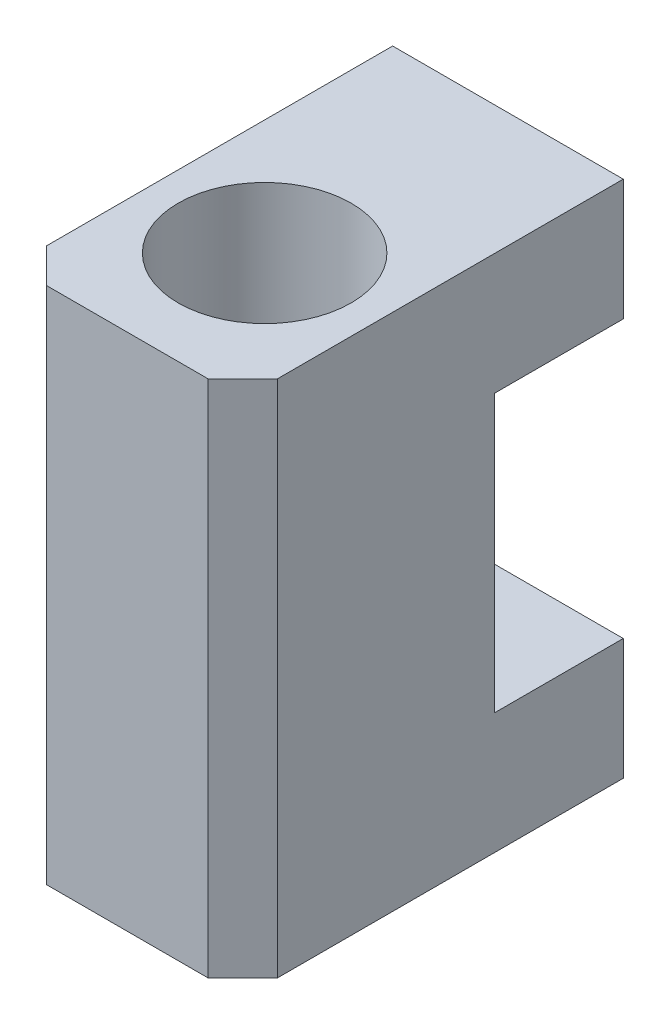
ISO-10303-21;
HEADER;
FILE_DESCRIPTION(('STEP AP214'),'2;1');
FILE_NAME('part.step','',(''),(''),'','','');
FILE_SCHEMA(('AUTOMOTIVE_DESIGN { 1 0 10303 214 1 1 1 1 }'));
ENDSEC;
DATA;
#1=APPLICATION_CONTEXT('core data for automotive mechanical design processes');
#2=APPLICATION_PROTOCOL_DEFINITION('international standard','automotive_design',2000,#1);
#3=PRODUCT_CONTEXT('',#1,'mechanical');
#4=PRODUCT('Part','Part','',(#3));
#5=PRODUCT_RELATED_PRODUCT_CATEGORY('part','',(#4));
#6=PRODUCT_DEFINITION_FORMATION('','',#4);
#7=PRODUCT_DEFINITION_CONTEXT('part definition',#1,'design');
#8=PRODUCT_DEFINITION('design','',#6,#7);
#9=PRODUCT_DEFINITION_SHAPE('','',#8);
#10=(LENGTH_UNIT() NAMED_UNIT(*) SI_UNIT(.MILLI.,.METRE.));
#11=(NAMED_UNIT(*) PLANE_ANGLE_UNIT() SI_UNIT($,.RADIAN.));
#12=(NAMED_UNIT(*) SI_UNIT($,.STERADIAN.) SOLID_ANGLE_UNIT());
#13=UNCERTAINTY_MEASURE_WITH_UNIT(LENGTH_MEASURE(1.E-05),#10,'distance_accuracy_value','');
#14=(GEOMETRIC_REPRESENTATION_CONTEXT(3) GLOBAL_UNCERTAINTY_ASSIGNED_CONTEXT((#13)) GLOBAL_UNIT_ASSIGNED_CONTEXT((#10,
#11,#12)) REPRESENTATION_CONTEXT('',''));
#15=CARTESIAN_POINT('',(0.,0.,0.));
#16=DIRECTION('',(0.,0.,1.));
#17=DIRECTION('',(1.,0.,0.));
#18=AXIS2_PLACEMENT_3D('',#15,#16,#17);
#19=CARTESIAN_POINT('',(0.,0.,-33.));
#20=DIRECTION('',(0.,0.,-1.));
#21=DIRECTION('',(-1.,0.,0.));
#22=AXIS2_PLACEMENT_3D('',#19,#20,#21);
#23=PLANE('',#22);
#24=DIRECTION('',(1.,0.,0.));
#25=VECTOR('',#24,1.);
#26=CARTESIAN_POINT('',(0.,34.5,-33.));
#27=LINE('',#26,#25);
#28=CARTESIAN_POINT('',(0.,34.5,-33.));
#29=VERTEX_POINT('',#28);
#30=CARTESIAN_POINT('',(20.,34.5,-33.));
#31=VERTEX_POINT('',#30);
#32=EDGE_CURVE('E43',#29,#31,#27,.T.);
#33=ORIENTED_EDGE('',*,*,#32,.F.);
#34=DIRECTION('',(0.,-1.,0.));
#35=VECTOR('',#34,1.);
#36=CARTESIAN_POINT('',(0.,0.,-33.));
#37=LINE('',#36,#35);
#38=CARTESIAN_POINT('',(0.,45.,-33.));
#39=VERTEX_POINT('',#38);
#40=EDGE_CURVE('E142',#39,#29,#37,.T.);
#41=ORIENTED_EDGE('',*,*,#40,.F.);
#42=DIRECTION('',(-1.,0.,0.));
#43=VECTOR('',#42,1.);
#44=CARTESIAN_POINT('',(0.,45.,-33.));
#45=LINE('',#44,#43);
#46=CARTESIAN_POINT('',(20.,45.,-33.));
#47=VERTEX_POINT('',#46);
#48=EDGE_CURVE('E157',#47,#39,#45,.T.);
#49=ORIENTED_EDGE('',*,*,#48,.F.);
#50=DIRECTION('',(0.,1.,0.));
#51=VECTOR('',#50,1.);
#52=CARTESIAN_POINT('',(20.,0.,-33.));
#53=LINE('',#52,#51);
#54=EDGE_CURVE('E154',#31,#47,#53,.T.);
#55=ORIENTED_EDGE('',*,*,#54,.F.);
#56=EDGE_LOOP('',(#33,#41,#49,#55));
#57=FACE_BOUND('',#56,.T.);
#58=CARTESIAN_POINT('',(10.,39.,-33.));
#59=DIRECTION('',(0.,0.,-1.));
#60=DIRECTION('',(-1.,0.,0.));
#61=AXIS2_PLACEMENT_3D('',#58,#59,#60);
#62=CIRCLE('',#61,2.);
#63=CARTESIAN_POINT('',(8.,39.,-33.));
#64=VERTEX_POINT('',#63);
#65=EDGE_CURVE('E233',#64,#64,#62,.T.);
#66=ORIENTED_EDGE('',*,*,#65,.F.);
#67=EDGE_LOOP('',(#66));
#68=FACE_BOUND('',#67,.T.);
#69=ADVANCED_FACE('F35',(#57,#68),#23,.T.);
#70=CARTESIAN_POINT('',(0.,0.,-33.));
#71=DIRECTION('',(-1.,0.,0.));
#72=DIRECTION('',(0.,0.,1.));
#73=AXIS2_PLACEMENT_3D('',#70,#71,#72);
#74=PLANE('',#73);
#75=DIRECTION('',(0.,0.,-1.));
#76=VECTOR('',#75,1.);
#77=CARTESIAN_POINT('',(0.,34.5,-33.));
#78=LINE('',#77,#76);
#79=CARTESIAN_POINT('',(0.,34.5,-21.8540067878814));
#80=VERTEX_POINT('',#79);
#81=EDGE_CURVE('E194',#80,#29,#78,.T.);
#82=ORIENTED_EDGE('',*,*,#81,.F.);
#83=DIRECTION('',(0.,1.,0.));
#84=VECTOR('',#83,1.);
#85=CARTESIAN_POINT('',(0.,34.5,-21.8540067878814));
#86=LINE('',#85,#84);
#87=CARTESIAN_POINT('',(0.,10.5,-21.8540067878814));
#88=VERTEX_POINT('',#87);
#89=EDGE_CURVE('E135',#88,#80,#86,.T.);
#90=ORIENTED_EDGE('',*,*,#89,.F.);
#91=DIRECTION('',(0.,0.,1.));
#92=VECTOR('',#91,1.);
#93=CARTESIAN_POINT('',(0.,10.5,-33.));
#94=LINE('',#93,#92);
#95=CARTESIAN_POINT('',(0.,10.5,-33.));
#96=VERTEX_POINT('',#95);
#97=EDGE_CURVE('E120',#96,#88,#94,.T.);
#98=ORIENTED_EDGE('',*,*,#97,.F.);
#99=CARTESIAN_POINT('',(0.,0.,-33.));
#100=VERTEX_POINT('',#99);
#101=EDGE_CURVE('E132',#96,#100,#37,.T.);
#102=ORIENTED_EDGE('',*,*,#101,.T.);
#103=DIRECTION('',(0.,0.,1.));
#104=VECTOR('',#103,1.);
#105=CARTESIAN_POINT('',(0.,0.,-33.));
#106=LINE('',#105,#104);
#107=CARTESIAN_POINT('',(0.,0.,-3.00000000000002));
#108=VERTEX_POINT('',#107);
#109=EDGE_CURVE('E160',#100,#108,#106,.T.);
#110=ORIENTED_EDGE('',*,*,#109,.T.);
#111=DIRECTION('',(0.,1.,0.));
#112=VECTOR('',#111,1.);
#113=CARTESIAN_POINT('',(0.,45.,-3.00000000000002));
#114=LINE('',#113,#112);
#115=CARTESIAN_POINT('',(0.,45.,-3.00000000000002));
#116=VERTEX_POINT('',#115);
#117=EDGE_CURVE('E183',#108,#116,#114,.T.);
#118=ORIENTED_EDGE('',*,*,#117,.T.);
#119=DIRECTION('',(0.,0.,1.));
#120=VECTOR('',#119,1.);
#121=CARTESIAN_POINT('',(0.,45.,-33.));
#122=LINE('',#121,#120);
#123=EDGE_CURVE('E164',#39,#116,#122,.T.);
#124=ORIENTED_EDGE('',*,*,#123,.F.);
#125=ORIENTED_EDGE('',*,*,#40,.T.);
#126=EDGE_LOOP('',(#82,#90,#98,#102,#110,#118,#124,#125));
#127=FACE_BOUND('',#126,.T.);
#128=ADVANCED_FACE('F130',(#127),#74,.T.);
#129=CARTESIAN_POINT('',(0.,45.,-33.));
#130=DIRECTION('',(0.,1.,0.));
#131=DIRECTION('',(0.,0.,1.));
#132=AXIS2_PLACEMENT_3D('',#129,#130,#131);
#133=PLANE('',#132);
#134=CARTESIAN_POINT('',(10.,45.,-11.9));
#135=DIRECTION('',(0.,-1.,0.));
#136=DIRECTION('',(0.,0.,-1.));
#137=AXIS2_PLACEMENT_3D('',#134,#135,#136);
#138=CIRCLE('',#137,7.49999999999999);
#139=CARTESIAN_POINT('',(10.,45.,-19.4));
#140=VERTEX_POINT('',#139);
#141=EDGE_CURVE('E162',#140,#140,#138,.T.);
#142=ORIENTED_EDGE('',*,*,#141,.T.);
#143=EDGE_LOOP('',(#142));
#144=FACE_BOUND('',#143,.T.);
#145=ORIENTED_EDGE('',*,*,#123,.T.);
#146=DIRECTION('',(0.707106781186546,0.,0.707106781186549));
#147=VECTOR('',#146,1.);
#148=CARTESIAN_POINT('',(-15.,45.,-18.0000000000001));
#149=LINE('',#148,#147);
#150=CARTESIAN_POINT('',(3.,45.,0.));
#151=VERTEX_POINT('',#150);
#152=EDGE_CURVE('E186',#116,#151,#149,.T.);
#153=ORIENTED_EDGE('',*,*,#152,.T.);
#154=DIRECTION('',(-1.,0.,0.));
#155=VECTOR('',#154,1.);
#156=CARTESIAN_POINT('',(0.,45.,0.));
#157=LINE('',#156,#155);
#158=CARTESIAN_POINT('',(17.,45.,0.));
#159=VERTEX_POINT('',#158);
#160=EDGE_CURVE('E143',#159,#151,#157,.T.);
#161=ORIENTED_EDGE('',*,*,#160,.F.);
#162=DIRECTION('',(0.707106781186546,0.,-0.707106781186549));
#163=VECTOR('',#162,1.);
#164=CARTESIAN_POINT('',(25.,45.,-8.00000000000007));
#165=LINE('',#164,#163);
#166=CARTESIAN_POINT('',(20.,45.,-3.00000000000001));
#167=VERTEX_POINT('',#166);
#168=EDGE_CURVE('E58',#159,#167,#165,.T.);
#169=ORIENTED_EDGE('',*,*,#168,.T.);
#170=DIRECTION('',(0.,0.,1.));
#171=VECTOR('',#170,1.);
#172=CARTESIAN_POINT('',(20.,45.,-33.));
#173=LINE('',#172,#171);
#174=EDGE_CURVE('E168',#47,#167,#173,.T.);
#175=ORIENTED_EDGE('',*,*,#174,.F.);
#176=ORIENTED_EDGE('',*,*,#48,.T.);
#177=EDGE_LOOP('',(#145,#153,#161,#169,#175,#176));
#178=FACE_BOUND('',#177,.T.);
#179=ADVANCED_FACE('F205',(#144,#178),#133,.T.);
#180=CARTESIAN_POINT('',(20.,0.,-33.));
#181=DIRECTION('',(1.,0.,0.));
#182=DIRECTION('',(0.,0.,-1.));
#183=AXIS2_PLACEMENT_3D('',#180,#181,#182);
#184=PLANE('',#183);
#185=DIRECTION('',(0.,0.,1.));
#186=VECTOR('',#185,1.);
#187=CARTESIAN_POINT('',(20.,34.5,-33.));
#188=LINE('',#187,#186);
#189=CARTESIAN_POINT('',(20.,34.5,-21.8540067878814));
#190=VERTEX_POINT('',#189);
#191=EDGE_CURVE('E192',#31,#190,#188,.T.);
#192=ORIENTED_EDGE('',*,*,#191,.F.);
#193=ORIENTED_EDGE('',*,*,#54,.T.);
#194=ORIENTED_EDGE('',*,*,#174,.T.);
#195=DIRECTION('',(0.,-1.,0.));
#196=VECTOR('',#195,1.);
#197=CARTESIAN_POINT('',(20.,0.,-3.00000000000001));
#198=LINE('',#197,#196);
#199=CARTESIAN_POINT('',(20.,0.,-3.00000000000001));
#200=VERTEX_POINT('',#199);
#201=EDGE_CURVE('E126',#167,#200,#198,.T.);
#202=ORIENTED_EDGE('',*,*,#201,.T.);
#203=DIRECTION('',(0.,0.,1.));
#204=VECTOR('',#203,1.);
#205=CARTESIAN_POINT('',(20.,0.,-33.));
#206=LINE('',#205,#204);
#207=CARTESIAN_POINT('',(20.,0.,-33.));
#208=VERTEX_POINT('',#207);
#209=EDGE_CURVE('E170',#208,#200,#206,.T.);
#210=ORIENTED_EDGE('',*,*,#209,.F.);
#211=CARTESIAN_POINT('',(20.,10.5,-33.));
#212=VERTEX_POINT('',#211);
#213=EDGE_CURVE('E155',#208,#212,#53,.T.);
#214=ORIENTED_EDGE('',*,*,#213,.T.);
#215=DIRECTION('',(0.,0.,-1.));
#216=VECTOR('',#215,1.);
#217=CARTESIAN_POINT('',(20.,10.5,-33.));
#218=LINE('',#217,#216);
#219=CARTESIAN_POINT('',(20.,10.5,-21.8540067878814));
#220=VERTEX_POINT('',#219);
#221=EDGE_CURVE('E50',#220,#212,#218,.T.);
#222=ORIENTED_EDGE('',*,*,#221,.F.);
#223=DIRECTION('',(0.,-1.,0.));
#224=VECTOR('',#223,1.);
#225=CARTESIAN_POINT('',(20.,0.,-21.8540067878814));
#226=LINE('',#225,#224);
#227=EDGE_CURVE('E11',#190,#220,#226,.T.);
#228=ORIENTED_EDGE('',*,*,#227,.F.);
#229=EDGE_LOOP('',(#192,#193,#194,#202,#210,#214,#222,#228));
#230=FACE_BOUND('',#229,.T.);
#231=ADVANCED_FACE('F200',(#230),#184,.T.);
#232=CARTESIAN_POINT('',(0.,0.,-33.));
#233=DIRECTION('',(0.,-1.,0.));
#234=DIRECTION('',(0.,0.,-1.));
#235=AXIS2_PLACEMENT_3D('',#232,#233,#234);
#236=PLANE('',#235);
#237=CARTESIAN_POINT('',(10.,0.,-11.9));
#238=DIRECTION('',(0.,-1.,0.));
#239=DIRECTION('',(0.,0.,-1.));
#240=AXIS2_PLACEMENT_3D('',#237,#238,#239);
#241=CIRCLE('',#240,7.49999999999999);
#242=CARTESIAN_POINT('',(10.,0.,-19.4));
#243=VERTEX_POINT('',#242);
#244=EDGE_CURVE('E151',#243,#243,#241,.T.);
#245=ORIENTED_EDGE('',*,*,#244,.F.);
#246=EDGE_LOOP('',(#245));
#247=FACE_BOUND('',#246,.T.);
#248=DIRECTION('',(1.,0.,0.));
#249=VECTOR('',#248,1.);
#250=CARTESIAN_POINT('',(0.,0.,0.));
#251=LINE('',#250,#249);
#252=CARTESIAN_POINT('',(3.,0.,0.));
#253=VERTEX_POINT('',#252);
#254=CARTESIAN_POINT('',(17.,0.,0.));
#255=VERTEX_POINT('',#254);
#256=EDGE_CURVE('E147',#253,#255,#251,.T.);
#257=ORIENTED_EDGE('',*,*,#256,.F.);
#258=DIRECTION('',(-0.707106781186546,0.,-0.707106781186549));
#259=VECTOR('',#258,1.);
#260=CARTESIAN_POINT('',(-15.,0.,-18.0000000000001));
#261=LINE('',#260,#259);
#262=EDGE_CURVE('E181',#253,#108,#261,.T.);
#263=ORIENTED_EDGE('',*,*,#262,.T.);
#264=ORIENTED_EDGE('',*,*,#109,.F.);
#265=DIRECTION('',(1.,0.,0.));
#266=VECTOR('',#265,1.);
#267=CARTESIAN_POINT('',(0.,0.,-33.));
#268=LINE('',#267,#266);
#269=EDGE_CURVE('E141',#100,#208,#268,.T.);
#270=ORIENTED_EDGE('',*,*,#269,.T.);
#271=ORIENTED_EDGE('',*,*,#209,.T.);
#272=DIRECTION('',(-0.707106781186546,0.,0.707106781186549));
#273=VECTOR('',#272,1.);
#274=CARTESIAN_POINT('',(25.,0.,-8.00000000000007));
#275=LINE('',#274,#273);
#276=EDGE_CURVE('E179',#200,#255,#275,.T.);
#277=ORIENTED_EDGE('',*,*,#276,.T.);
#278=EDGE_LOOP('',(#257,#263,#264,#270,#271,#277));
#279=FACE_BOUND('',#278,.T.);
#280=ADVANCED_FACE('F213',(#247,#279),#236,.T.);
#281=DIRECTION('',(-1.,0.,0.));
#282=VECTOR('',#281,1.);
#283=CARTESIAN_POINT('',(0.,10.5,-33.));
#284=LINE('',#283,#282);
#285=EDGE_CURVE('E117',#212,#96,#284,.T.);
#286=ORIENTED_EDGE('',*,*,#285,.F.);
#287=ORIENTED_EDGE('',*,*,#213,.F.);
#288=ORIENTED_EDGE('',*,*,#269,.F.);
#289=ORIENTED_EDGE('',*,*,#101,.F.);
#290=EDGE_LOOP('',(#286,#287,#288,#289));
#291=FACE_BOUND('',#290,.T.);
#292=CARTESIAN_POINT('',(10.,6.,-33.));
#293=DIRECTION('',(0.,0.,-1.));
#294=DIRECTION('',(-1.,0.,0.));
#295=AXIS2_PLACEMENT_3D('',#292,#293,#294);
#296=CIRCLE('',#295,2.);
#297=CARTESIAN_POINT('',(8.,6.,-33.));
#298=VERTEX_POINT('',#297);
#299=EDGE_CURVE('E201',#298,#298,#296,.T.);
#300=ORIENTED_EDGE('',*,*,#299,.F.);
#301=EDGE_LOOP('',(#300));
#302=FACE_BOUND('',#301,.T.);
#303=ADVANCED_FACE('F138',(#291,#302),#23,.T.);
#304=CARTESIAN_POINT('',(0.,0.,0.));
#305=DIRECTION('',(0.,0.,-1.));
#306=DIRECTION('',(-1.,0.,0.));
#307=AXIS2_PLACEMENT_3D('',#304,#305,#306);
#308=PLANE('',#307);
#309=ORIENTED_EDGE('',*,*,#160,.T.);
#310=DIRECTION('',(0.,-1.,0.));
#311=VECTOR('',#310,1.);
#312=CARTESIAN_POINT('',(3.,0.,0.));
#313=LINE('',#312,#311);
#314=EDGE_CURVE('E176',#151,#253,#313,.T.);
#315=ORIENTED_EDGE('',*,*,#314,.T.);
#316=ORIENTED_EDGE('',*,*,#256,.T.);
#317=DIRECTION('',(0.,1.,0.));
#318=VECTOR('',#317,1.);
#319=CARTESIAN_POINT('',(17.,45.,0.));
#320=LINE('',#319,#318);
#321=EDGE_CURVE('E167',#255,#159,#320,.T.);
#322=ORIENTED_EDGE('',*,*,#321,.T.);
#323=EDGE_LOOP('',(#309,#315,#316,#322));
#324=FACE_BOUND('',#323,.T.);
#325=ADVANCED_FACE('F215',(#324),#308,.F.);
#326=CARTESIAN_POINT('',(10.,45.,-11.9));
#327=DIRECTION('',(0.,-1.,0.));
#328=DIRECTION('',(0.,0.,-1.));
#329=AXIS2_PLACEMENT_3D('',#326,#327,#328);
#330=CYLINDRICAL_SURFACE('',#329,7.49999999999999);
#331=CARTESIAN_POINT('',(10.,45.,-19.4));
#332=CARTESIAN_POINT('',(10.,44.53125,-19.4));
#333=CARTESIAN_POINT('',(10.,44.0625,-19.4));
#334=CARTESIAN_POINT('',(10.,43.125,-19.4));
#335=CARTESIAN_POINT('',(10.,42.65625,-19.4));
#336=CARTESIAN_POINT('',(10.,41.71875,-19.4));
#337=CARTESIAN_POINT('',(10.,41.25,-19.4));
#338=CARTESIAN_POINT('',(10.,40.3125,-19.4));
#339=CARTESIAN_POINT('',(10.,39.84375,-19.4));
#340=CARTESIAN_POINT('',(10.,38.90625,-19.4));
#341=CARTESIAN_POINT('',(10.,38.4375,-19.4));
#342=CARTESIAN_POINT('',(10.,37.5,-19.4));
#343=CARTESIAN_POINT('',(10.,37.03125,-19.4));
#344=CARTESIAN_POINT('',(10.,36.09375,-19.4));
#345=CARTESIAN_POINT('',(10.,35.625,-19.4));
#346=CARTESIAN_POINT('',(10.,34.6875,-19.4));
#347=CARTESIAN_POINT('',(10.,34.21875,-19.4));
#348=CARTESIAN_POINT('',(10.,33.28125,-19.4));
#349=CARTESIAN_POINT('',(10.,32.8125,-19.4));
#350=CARTESIAN_POINT('',(10.,31.875,-19.4));
#351=CARTESIAN_POINT('',(10.,31.40625,-19.4));
#352=CARTESIAN_POINT('',(10.,30.46875,-19.4));
#353=CARTESIAN_POINT('',(10.,30.,-19.4));
#354=CARTESIAN_POINT('',(10.,29.0625,-19.4));
#355=CARTESIAN_POINT('',(10.,28.59375,-19.4));
#356=CARTESIAN_POINT('',(10.,27.65625,-19.4));
#357=CARTESIAN_POINT('',(10.,27.1875,-19.4));
#358=CARTESIAN_POINT('',(10.,26.25,-19.4));
#359=CARTESIAN_POINT('',(10.,25.78125,-19.4));
#360=CARTESIAN_POINT('',(10.,24.84375,-19.4));
#361=CARTESIAN_POINT('',(10.,24.375,-19.4));
#362=CARTESIAN_POINT('',(10.,23.4375,-19.4));
#363=CARTESIAN_POINT('',(10.,22.96875,-19.4));
#364=CARTESIAN_POINT('',(10.,22.03125,-19.4));
#365=CARTESIAN_POINT('',(10.,21.5625,-19.4));
#366=CARTESIAN_POINT('',(10.,20.625,-19.4));
#367=CARTESIAN_POINT('',(10.,20.15625,-19.4));
#368=CARTESIAN_POINT('',(10.,19.21875,-19.4));
#369=CARTESIAN_POINT('',(10.,18.75,-19.4));
#370=CARTESIAN_POINT('',(10.,17.8125,-19.4));
#371=CARTESIAN_POINT('',(10.,17.34375,-19.4));
#372=CARTESIAN_POINT('',(10.,16.40625,-19.4));
#373=CARTESIAN_POINT('',(10.,15.9375,-19.4));
#374=CARTESIAN_POINT('',(10.,15.,-19.4));
#375=CARTESIAN_POINT('',(10.,14.53125,-19.4));
#376=CARTESIAN_POINT('',(10.,13.59375,-19.4));
#377=CARTESIAN_POINT('',(10.,13.125,-19.4));
#378=CARTESIAN_POINT('',(10.,12.1875,-19.4));
#379=CARTESIAN_POINT('',(10.,11.71875,-19.4));
#380=CARTESIAN_POINT('',(10.,10.78125,-19.4));
#381=CARTESIAN_POINT('',(10.,10.3125,-19.4));
#382=CARTESIAN_POINT('',(10.,9.37500000000001,-19.4));
#383=CARTESIAN_POINT('',(10.,8.90625000000001,-19.4));
#384=CARTESIAN_POINT('',(10.,7.96875000000001,-19.4));
#385=CARTESIAN_POINT('',(10.,7.50000000000001,-19.4));
#386=CARTESIAN_POINT('',(10.,6.56250000000001,-19.4));
#387=CARTESIAN_POINT('',(10.,6.09375000000001,-19.4));
#388=CARTESIAN_POINT('',(10.,5.15625000000001,-19.4));
#389=CARTESIAN_POINT('',(10.,4.68750000000001,-19.4));
#390=CARTESIAN_POINT('',(10.,3.75000000000001,-19.4));
#391=CARTESIAN_POINT('',(10.,3.28125000000001,-19.4));
#392=CARTESIAN_POINT('',(10.,2.34375000000001,-19.4));
#393=CARTESIAN_POINT('',(10.,1.87500000000001,-19.4));
#394=CARTESIAN_POINT('',(10.,0.937500000000006,-19.4));
#395=CARTESIAN_POINT('',(10.,0.468750000000007,-19.4));
#396=CARTESIAN_POINT('',(10.,0.,-19.4));
#397=B_SPLINE_CURVE_WITH_KNOTS('',3,(#331,#332,#333,#334,#335,#336,#337,#338,#339,#340,#341,
#342,#343,#344,#345,#346,#347,#348,#349,#350,#351,#352,#353,#354,#355,#356,#357,#358,#359,#360,
#361,#362,#363,#364,#365,#366,#367,#368,#369,#370,#371,#372,#373,#374,#375,#376,#377,#378,#379,
#380,#381,#382,#383,#384,#385,#386,#387,#388,#389,#390,#391,#392,#393,#394,#395,#396),
.UNSPECIFIED.,.F.,.F.,(4,2,2,2,2,2,2,2,2,2,2,2,2,2,2,2,2,2,2,2,2,2,2,2,2,2,2,2,2,2,2,2,4),(0.,
1.40625,2.8125,4.21875,5.62500000000001,7.03125,8.4375,9.84375000000001,11.25,12.65625,14.0625,
15.46875,16.875,18.28125,19.6875,21.09375,22.5,23.90625,25.3125,26.71875,28.125,29.53125,
30.9375,32.34375,33.75,35.15625,36.5625,37.96875,39.375,40.78125,42.1875,43.59375,45.),.UNSPECIFIED.);
#398=EDGE_CURVE('BSEAM244',#140,#243,#397,.T.);
#399=ORIENTED_EDGE('',*,*,#141,.F.);
#400=ORIENTED_EDGE('',*,*,#244,.T.);
#401=ORIENTED_EDGE('',*,*,#398,.T.);
#402=ORIENTED_EDGE('',*,*,#398,.F.);
#403=EDGE_LOOP('',(#399,#401,#400,#402));
#404=FACE_BOUND('',#403,.T.);
#405=ADVANCED_FACE('F244',(#404),#330,.F.);
#406=CARTESIAN_POINT('',(10.,39.,-23.));
#407=DIRECTION('',(0.,0.,-1.));
#408=DIRECTION('',(-1.,0.,0.));
#409=AXIS2_PLACEMENT_3D('',#406,#407,#408);
#410=CONICAL_SURFACE('',#409,2.,1.02974425867665);
#411=CARTESIAN_POINT('',(10.,39.,-21.7982787619449));
#412=VERTEX_POINT('',#411);
#413=VERTEX_LOOP('',#412);
#414=FACE_BOUND('',#413,.T.);
#415=CARTESIAN_POINT('',(10.,39.,-23.));
#416=DIRECTION('',(0.,0.,-1.));
#417=DIRECTION('',(-1.,0.,0.));
#418=AXIS2_PLACEMENT_3D('',#415,#416,#417);
#419=CIRCLE('',#418,2.);
#420=CARTESIAN_POINT('',(8.00000000000001,39.,-23.));
#421=VERTEX_POINT('',#420);
#422=EDGE_CURVE('E236',#421,#421,#419,.T.);
#423=ORIENTED_EDGE('',*,*,#422,.T.);
#424=EDGE_LOOP('',(#423));
#425=FACE_BOUND('',#424,.T.);
#426=ADVANCED_FACE('F327',(#414,#425),#410,.F.);
#427=CARTESIAN_POINT('',(10.,39.,-33.));
#428=DIRECTION('',(0.,0.,-1.));
#429=DIRECTION('',(-1.,0.,0.));
#430=AXIS2_PLACEMENT_3D('',#427,#428,#429);
#431=CYLINDRICAL_SURFACE('',#430,2.);
#432=ORIENTED_EDGE('',*,*,#422,.F.);
#433=EDGE_LOOP('',(#432));
#434=FACE_BOUND('',#433,.T.);
#435=ORIENTED_EDGE('',*,*,#65,.T.);
#436=EDGE_LOOP('',(#435));
#437=FACE_BOUND('',#436,.T.);
#438=ADVANCED_FACE('F324',(#434,#437),#431,.F.);
#439=CARTESIAN_POINT('',(10.,6.,-23.));
#440=DIRECTION('',(0.,0.,-1.));
#441=DIRECTION('',(-1.,0.,0.));
#442=AXIS2_PLACEMENT_3D('',#439,#440,#441);
#443=CONICAL_SURFACE('',#442,2.,1.02974425867665);
#444=CARTESIAN_POINT('',(10.,6.,-21.7982787619449));
#445=VERTEX_POINT('',#444);
#446=VERTEX_LOOP('',#445);
#447=FACE_BOUND('',#446,.T.);
#448=CARTESIAN_POINT('',(10.,6.,-23.));
#449=DIRECTION('',(0.,0.,-1.));
#450=DIRECTION('',(-1.,0.,0.));
#451=AXIS2_PLACEMENT_3D('',#448,#449,#450);
#452=CIRCLE('',#451,2.);
#453=CARTESIAN_POINT('',(8.,6.,-23.));
#454=VERTEX_POINT('',#453);
#455=EDGE_CURVE('E230',#454,#454,#452,.T.);
#456=ORIENTED_EDGE('',*,*,#455,.T.);
#457=EDGE_LOOP('',(#456));
#458=FACE_BOUND('',#457,.T.);
#459=ADVANCED_FACE('F320',(#447,#458),#443,.F.);
#460=CARTESIAN_POINT('',(10.,6.,-33.));
#461=DIRECTION('',(0.,0.,-1.));
#462=DIRECTION('',(-1.,0.,0.));
#463=AXIS2_PLACEMENT_3D('',#460,#461,#462);
#464=CYLINDRICAL_SURFACE('',#463,2.);
#465=ORIENTED_EDGE('',*,*,#455,.F.);
#466=EDGE_LOOP('',(#465));
#467=FACE_BOUND('',#466,.T.);
#468=ORIENTED_EDGE('',*,*,#299,.T.);
#469=EDGE_LOOP('',(#468));
#470=FACE_BOUND('',#469,.T.);
#471=ADVANCED_FACE('F317',(#467,#470),#464,.F.);
#472=CARTESIAN_POINT('',(3.,0.,0.));
#473=DIRECTION('',(-0.707106781186549,0.,0.707106781186546));
#474=DIRECTION('',(0.,1.,0.));
#475=AXIS2_PLACEMENT_3D('',#472,#473,#474);
#476=PLANE('',#475);
#477=ORIENTED_EDGE('',*,*,#152,.F.);
#478=ORIENTED_EDGE('',*,*,#117,.F.);
#479=ORIENTED_EDGE('',*,*,#262,.F.);
#480=ORIENTED_EDGE('',*,*,#314,.F.);
#481=EDGE_LOOP('',(#477,#478,#479,#480));
#482=FACE_BOUND('',#481,.T.);
#483=ADVANCED_FACE('F218',(#482),#476,.T.);
#484=CARTESIAN_POINT('',(17.,0.,0.));
#485=DIRECTION('',(0.707106781186549,0.,0.707106781186546));
#486=DIRECTION('',(0.,-1.,0.));
#487=AXIS2_PLACEMENT_3D('',#484,#485,#486);
#488=PLANE('',#487);
#489=ORIENTED_EDGE('',*,*,#276,.F.);
#490=ORIENTED_EDGE('',*,*,#201,.F.);
#491=ORIENTED_EDGE('',*,*,#168,.F.);
#492=ORIENTED_EDGE('',*,*,#321,.F.);
#493=EDGE_LOOP('',(#489,#490,#491,#492));
#494=FACE_BOUND('',#493,.T.);
#495=ADVANCED_FACE('F37',(#494),#488,.T.);
#496=CARTESIAN_POINT('',(26.,34.5,-33.));
#497=DIRECTION('',(0.,1.,0.));
#498=DIRECTION('',(0.,0.,1.));
#499=AXIS2_PLACEMENT_3D('',#496,#497,#498);
#500=PLANE('',#499);
#501=ORIENTED_EDGE('',*,*,#191,.T.);
#502=DIRECTION('',(-1.,0.,0.));
#503=VECTOR('',#502,1.);
#504=CARTESIAN_POINT('',(26.,34.5,-21.8540067878814));
#505=LINE('',#504,#503);
#506=EDGE_CURVE('E222',#190,#80,#505,.T.);
#507=ORIENTED_EDGE('',*,*,#506,.T.);
#508=ORIENTED_EDGE('',*,*,#81,.T.);
#509=ORIENTED_EDGE('',*,*,#32,.T.);
#510=EDGE_LOOP('',(#501,#507,#508,#509));
#511=FACE_BOUND('',#510,.T.);
#512=ADVANCED_FACE('F191',(#511),#500,.F.);
#513=CARTESIAN_POINT('',(26.,34.5,-21.8540067878814));
#514=DIRECTION('',(0.,0.,1.));
#515=DIRECTION('',(0.,-1.,0.));
#516=AXIS2_PLACEMENT_3D('',#513,#514,#515);
#517=PLANE('',#516);
#518=ORIENTED_EDGE('',*,*,#227,.T.);
#519=DIRECTION('',(-1.,0.,0.));
#520=VECTOR('',#519,1.);
#521=CARTESIAN_POINT('',(26.,10.5,-21.8540067878814));
#522=LINE('',#521,#520);
#523=EDGE_CURVE('E220',#220,#88,#522,.T.);
#524=ORIENTED_EDGE('',*,*,#523,.T.);
#525=ORIENTED_EDGE('',*,*,#89,.T.);
#526=ORIENTED_EDGE('',*,*,#506,.F.);
#527=EDGE_LOOP('',(#518,#524,#525,#526));
#528=FACE_BOUND('',#527,.T.);
#529=ADVANCED_FACE('F293',(#528),#517,.F.);
#530=CARTESIAN_POINT('',(26.,10.5,-33.));
#531=DIRECTION('',(0.,-1.,0.));
#532=DIRECTION('',(0.,0.,-1.));
#533=AXIS2_PLACEMENT_3D('',#530,#531,#532);
#534=PLANE('',#533);
#535=ORIENTED_EDGE('',*,*,#221,.T.);
#536=ORIENTED_EDGE('',*,*,#285,.T.);
#537=ORIENTED_EDGE('',*,*,#97,.T.);
#538=ORIENTED_EDGE('',*,*,#523,.F.);
#539=EDGE_LOOP('',(#535,#536,#537,#538));
#540=FACE_BOUND('',#539,.T.);
#541=ADVANCED_FACE('F119',(#540),#534,.F.);
#542=CLOSED_SHELL('',(#69,#128,#179,#231,#280,#303,#325,#405,#426,#438,#459,#471,#483,#495,#512,
#529,#541));
#543=MANIFOLD_SOLID_BREP('B2',#542);
#544=ADVANCED_BREP_SHAPE_REPRESENTATION('',(#18,#543),#14);
#545=SHAPE_DEFINITION_REPRESENTATION(#9,#544);
ENDSEC;
END-ISO-10303-21;
